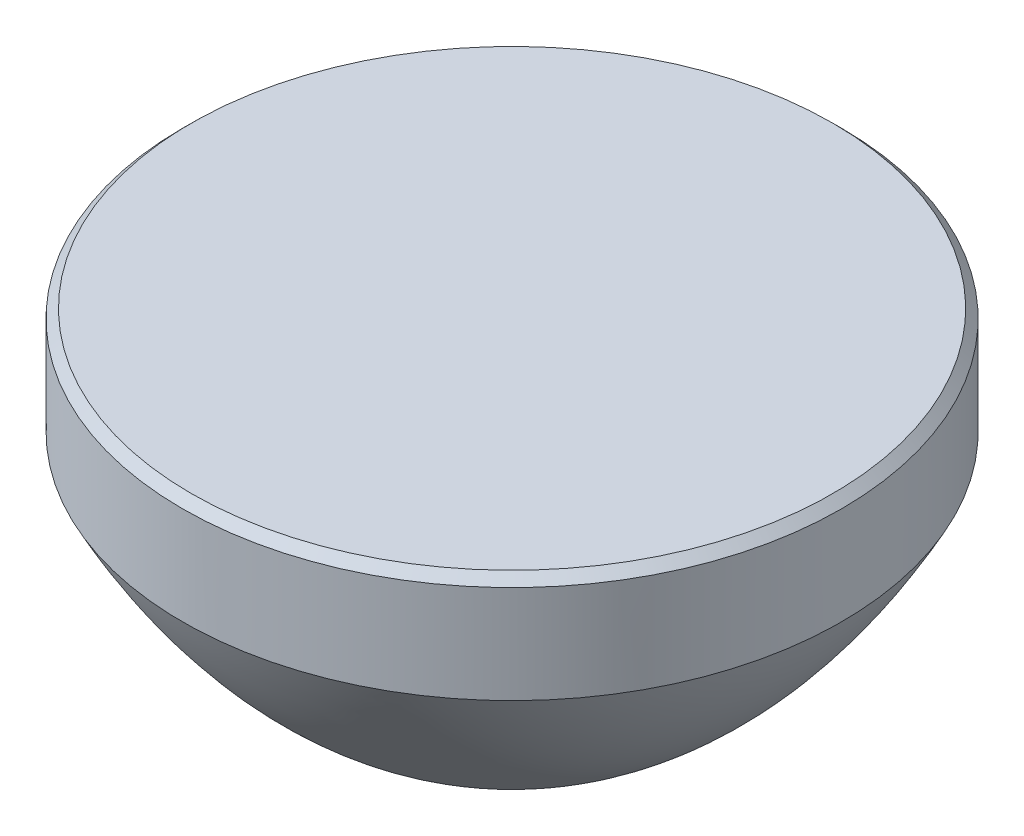
ISO-10303-21;
HEADER;
FILE_DESCRIPTION(('STEP AP214'),'2;1');
FILE_NAME('part.step','',(''),(''),'','','');
FILE_SCHEMA(('AUTOMOTIVE_DESIGN { 1 0 10303 214 1 1 1 1 }'));
ENDSEC;
DATA;
#1=APPLICATION_CONTEXT('core data for automotive mechanical design processes');
#2=APPLICATION_PROTOCOL_DEFINITION('international standard','automotive_design',2000,#1);
#3=PRODUCT_CONTEXT('',#1,'mechanical');
#4=PRODUCT('Part','Part','',(#3));
#5=PRODUCT_RELATED_PRODUCT_CATEGORY('part','',(#4));
#6=PRODUCT_DEFINITION_FORMATION('','',#4);
#7=PRODUCT_DEFINITION_CONTEXT('part definition',#1,'design');
#8=PRODUCT_DEFINITION('design','',#6,#7);
#9=PRODUCT_DEFINITION_SHAPE('','',#8);
#10=(LENGTH_UNIT() NAMED_UNIT(*) SI_UNIT(.MILLI.,.METRE.));
#11=(NAMED_UNIT(*) PLANE_ANGLE_UNIT() SI_UNIT($,.RADIAN.));
#12=(NAMED_UNIT(*) SI_UNIT($,.STERADIAN.) SOLID_ANGLE_UNIT());
#13=UNCERTAINTY_MEASURE_WITH_UNIT(LENGTH_MEASURE(1.E-05),#10,'distance_accuracy_value','');
#14=(GEOMETRIC_REPRESENTATION_CONTEXT(3) GLOBAL_UNCERTAINTY_ASSIGNED_CONTEXT((#13)) GLOBAL_UNIT_ASSIGNED_CONTEXT((#10,
#11,#12)) REPRESENTATION_CONTEXT('',''));
#15=CARTESIAN_POINT('',(0.,0.,0.));
#16=DIRECTION('',(0.,0.,1.));
#17=DIRECTION('',(1.,0.,0.));
#18=AXIS2_PLACEMENT_3D('',#15,#16,#17);
#19=CARTESIAN_POINT('',(0.,-4.,-1.53649057378836E-12));
#20=CARTESIAN_POINT('',(0.,-3.9999999999999,-0.0357002603592639));
#21=CARTESIAN_POINT('',(0.,-3.99925273067133,-0.107517480949098));
#22=CARTESIAN_POINT('',(0.,-3.99588996608907,-0.267506792010345));
#23=CARTESIAN_POINT('',(0.,-3.98693094978796,-0.411686436257666));
#24=CARTESIAN_POINT('',(0.,-3.9701562857839,-0.632666001570779));
#25=CARTESIAN_POINT('',(0.,-3.94115473080849,-0.875365147676959));
#26=CARTESIAN_POINT('',(0.,-3.89451167020878,-1.16998872131128));
#27=CARTESIAN_POINT('',(0.,-3.82400900156312,-1.49539747423547));
#28=CARTESIAN_POINT('',(0.,-3.73676507394039,-1.82112261154713));
#29=CARTESIAN_POINT('',(0.,-3.63334926665043,-2.13949457759478));
#30=CARTESIAN_POINT('',(0.,-3.51436886455229,-2.45393213916947));
#31=CARTESIAN_POINT('',(0.,-3.38055054248058,-2.76138257656326));
#32=CARTESIAN_POINT('',(0.,-3.23256605489587,-3.06286795189647));
#33=CARTESIAN_POINT('',(0.,-3.07127560915118,-3.35703054133746));
#34=CARTESIAN_POINT('',(0.,-2.89728934202754,-3.64417875688742));
#35=CARTESIAN_POINT('',(0.,-2.71164558163357,-3.92360735244253));
#36=CARTESIAN_POINT('',(0.,-2.50054103666197,-4.21509602069596));
#37=CARTESIAN_POINT('',(0.,-2.22576624832199,-4.56298256969428));
#38=CARTESIAN_POINT('',(0.,-1.93216063910035,-4.89657726251406));
#39=CARTESIAN_POINT('',(0.,-1.62424021788066,-5.21461263869168));
#40=CARTESIAN_POINT('',(0.,-1.25733013219945,-5.56154060797475));
#41=CARTESIAN_POINT('',(0.,-0.943971875546173,-5.83598965396021));
#42=CARTESIAN_POINT('',(0.,-0.61303043365126,-6.10210383003281));
#43=CARTESIAN_POINT('',(0.,-0.284299132589343,-6.35042174298218));
#44=CARTESIAN_POINT('',(0.,-0.000127642728406027,-6.55068075937507));
#45=CARTESIAN_POINT('',(0.,0.326642943118087,-6.77446446020739));
#46=CARTESIAN_POINT('',(0.,0.719522915456515,-7.01841244552593));
#47=CARTESIAN_POINT('',(0.,1.01958459498698,-7.19943915622637));
#48=CARTESIAN_POINT('',(0.,1.38347304764633,-7.39917412668954));
#49=CARTESIAN_POINT('',(0.,1.50888021466334,-7.46665286125926));
#50=CARTESIAN_POINT('',(0.,1.57201531578591,-7.49999999999083));
#51=B_SPLINE_CURVE_WITH_KNOTS('',4,(#19,#20,#21,#22,#23,#24,#25,#26,#27,#28,#29,#30,#31,#32,#33,
#34,#35,#36,#37,#38,#39,#40,#41,#42,#43,#44,#45,#46,#47,#48,#49,#50),.UNSPECIFIED.,.F.,.F.,(5,1,
1,1,1,1,1,1,1,1,1,1,1,1,1,1,1,1,1,1,1,1,1,1,1,1,1,1,5),(0.0651242698020646,0.0796565534344165,
0.0941888370667685,0.108721122261497,0.123253407456225,0.152317968255599,0.18138253454166,
0.210447097493191,0.239511658180185,0.268576221623938,0.297640809797257,0.326705341182296,
0.35576991015628,0.38483448206544,0.413899018240487,0.442963573939836,0.472028180744977,
0.509445760096886,0.567574828532454,0.596639439513576,0.625704050494698,0.683833063655526,
0.712897664274746,0.741962264893967,0.771026826966666,0.800091389039365,0.858220449868719,
0.887285126296585,0.91634980272445),.UNSPECIFIED.);
#52=CARTESIAN_POINT('',(0.,-4.,0.));
#53=DIRECTION('',(0.,-1.,0.));
#54=AXIS1_PLACEMENT('',#52,#53);
#55=SURFACE_OF_REVOLUTION('',#51,#54);
#56=CARTESIAN_POINT('',(0.,1.57201531578588,0.));
#57=DIRECTION('',(0.,-1.,0.));
#58=DIRECTION('',(0.,0.,-1.));
#59=AXIS2_PLACEMENT_3D('',#56,#57,#58);
#60=CIRCLE('',#59,7.49999999999081);
#61=CARTESIAN_POINT('',(0.,1.57201531578588,-7.49999999999081));
#62=VERTEX_POINT('',#61);
#63=EDGE_CURVE('E44',#62,#62,#60,.T.);
#64=ORIENTED_EDGE('',*,*,#63,.T.);
#65=EDGE_LOOP('',(#64));
#66=FACE_BOUND('',#65,.T.);
#67=CARTESIAN_POINT('',(0.,-4.,0.));
#68=VERTEX_POINT('',#67);
#69=VERTEX_LOOP('',#68);
#70=FACE_BOUND('',#69,.T.);
#71=ADVANCED_FACE('F17',(#66,#70),#55,.F.);
#72=CARTESIAN_POINT('',(0.,4.,-7.49999999999081));
#73=DIRECTION('',(0.,1.,0.));
#74=DIRECTION('',(0.,0.,1.));
#75=AXIS2_PLACEMENT_3D('',#72,#73,#74);
#76=PLANE('',#75);
#77=CARTESIAN_POINT('',(0.,4.,0.));
#78=DIRECTION('',(0.,1.,0.));
#79=DIRECTION('',(0.,0.,1.));
#80=AXIS2_PLACEMENT_3D('',#77,#78,#79);
#81=CIRCLE('',#80,7.29999999999081);
#82=CARTESIAN_POINT('',(0.,4.,7.29999999999081));
#83=VERTEX_POINT('',#82);
#84=EDGE_CURVE('E11',#83,#83,#81,.T.);
#85=ORIENTED_EDGE('',*,*,#84,.T.);
#86=EDGE_LOOP('',(#85));
#87=FACE_BOUND('',#86,.T.);
#88=ADVANCED_FACE('F28',(#87),#76,.T.);
#89=CARTESIAN_POINT('',(0.,-4.,0.));
#90=DIRECTION('',(0.,-1.,0.));
#91=DIRECTION('',(0.,0.,-1.));
#92=AXIS2_PLACEMENT_3D('',#89,#90,#91);
#93=CYLINDRICAL_SURFACE('',#92,7.49999999999081);
#94=CARTESIAN_POINT('',(0.,3.8,0.));
#95=DIRECTION('',(0.,1.,0.));
#96=DIRECTION('',(0.,0.,1.));
#97=AXIS2_PLACEMENT_3D('',#94,#95,#96);
#98=CIRCLE('',#97,7.49999999999081);
#99=CARTESIAN_POINT('',(0.,3.8,7.49999999999081));
#100=VERTEX_POINT('',#99);
#101=EDGE_CURVE('E24',#100,#100,#98,.F.);
#102=ORIENTED_EDGE('',*,*,#101,.T.);
#103=EDGE_LOOP('',(#102));
#104=FACE_BOUND('',#103,.T.);
#105=ORIENTED_EDGE('',*,*,#63,.F.);
#106=EDGE_LOOP('',(#105));
#107=FACE_BOUND('',#106,.T.);
#108=ADVANCED_FACE('F34',(#104,#107),#93,.T.);
#109=CARTESIAN_POINT('',(0.,3.8,0.));
#110=DIRECTION('',(0.,-1.,0.));
#111=DIRECTION('',(0.,0.,-1.));
#112=AXIS2_PLACEMENT_3D('',#109,#110,#111);
#113=CONICAL_SURFACE('',#112,7.49999999999081,0.785398163397444);
#114=ORIENTED_EDGE('',*,*,#84,.F.);
#115=EDGE_LOOP('',(#114));
#116=FACE_BOUND('',#115,.T.);
#117=ORIENTED_EDGE('',*,*,#101,.F.);
#118=EDGE_LOOP('',(#117));
#119=FACE_BOUND('',#118,.T.);
#120=ADVANCED_FACE('F19',(#116,#119),#113,.T.);
#121=CLOSED_SHELL('',(#71,#88,#108,#120));
#122=MANIFOLD_SOLID_BREP('B1',#121);
#123=ADVANCED_BREP_SHAPE_REPRESENTATION('',(#18,#122),#14);
#124=SHAPE_DEFINITION_REPRESENTATION(#9,#123);
ENDSEC;
END-ISO-10303-21;
